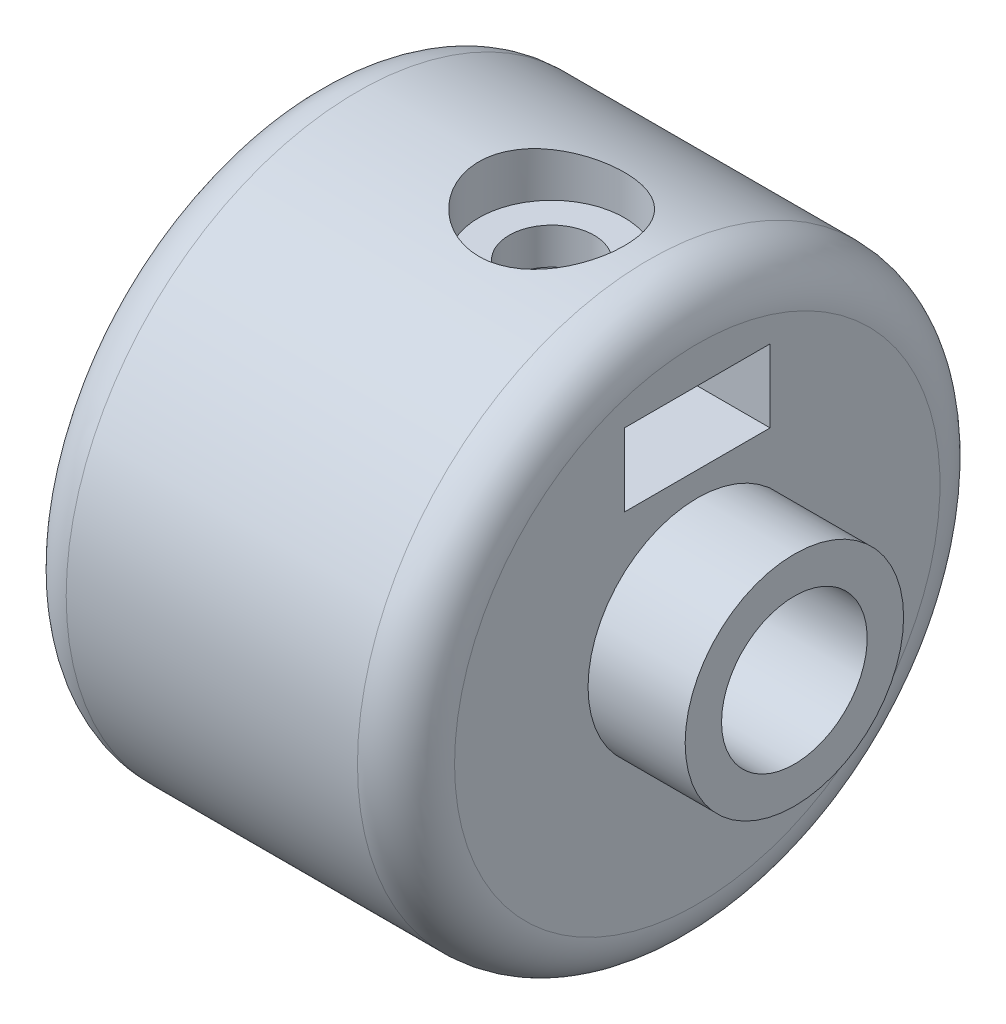
ISO-10303-21;
HEADER;
FILE_DESCRIPTION(('STEP AP214'),'2;1');
FILE_NAME('part.step','',(''),(''),'','','');
FILE_SCHEMA(('AUTOMOTIVE_DESIGN { 1 0 10303 214 1 1 1 1 }'));
ENDSEC;
DATA;
#1=APPLICATION_CONTEXT('core data for automotive mechanical design processes');
#2=APPLICATION_PROTOCOL_DEFINITION('international standard','automotive_design',2000,#1);
#3=PRODUCT_CONTEXT('',#1,'mechanical');
#4=PRODUCT('Part','Part','',(#3));
#5=PRODUCT_RELATED_PRODUCT_CATEGORY('part','',(#4));
#6=PRODUCT_DEFINITION_FORMATION('','',#4);
#7=PRODUCT_DEFINITION_CONTEXT('part definition',#1,'design');
#8=PRODUCT_DEFINITION('design','',#6,#7);
#9=PRODUCT_DEFINITION_SHAPE('','',#8);
#10=(LENGTH_UNIT() NAMED_UNIT(*) SI_UNIT(.MILLI.,.METRE.));
#11=(NAMED_UNIT(*) PLANE_ANGLE_UNIT() SI_UNIT($,.RADIAN.));
#12=(NAMED_UNIT(*) SI_UNIT($,.STERADIAN.) SOLID_ANGLE_UNIT());
#13=UNCERTAINTY_MEASURE_WITH_UNIT(LENGTH_MEASURE(1.E-05),#10,'distance_accuracy_value','');
#14=(GEOMETRIC_REPRESENTATION_CONTEXT(3) GLOBAL_UNCERTAINTY_ASSIGNED_CONTEXT((#13)) GLOBAL_UNIT_ASSIGNED_CONTEXT((#10,
#11,#12)) REPRESENTATION_CONTEXT('',''));
#15=CARTESIAN_POINT('',(0.,0.,0.));
#16=DIRECTION('',(0.,0.,1.));
#17=DIRECTION('',(1.,0.,0.));
#18=AXIS2_PLACEMENT_3D('',#15,#16,#17);
#19=CARTESIAN_POINT('',(-10.,12.,0.));
#20=DIRECTION('',(0.,-1.,0.));
#21=DIRECTION('',(0.,0.,-1.));
#22=AXIS2_PLACEMENT_3D('',#19,#20,#21);
#23=CYLINDRICAL_SURFACE('',#22,1.75);
#24=CARTESIAN_POINT('',(-10.,5.5,0.));
#25=DIRECTION('',(0.,-1.,0.));
#26=DIRECTION('',(0.,0.,-1.));
#27=AXIS2_PLACEMENT_3D('',#24,#25,#26);
#28=CIRCLE('',#27,1.75);
#29=CARTESIAN_POINT('',(-10.,5.5,-1.75));
#30=VERTEX_POINT('',#29);
#31=EDGE_CURVE('E109',#30,#30,#28,.T.);
#32=ORIENTED_EDGE('',*,*,#31,.F.);
#33=EDGE_LOOP('',(#32));
#34=FACE_BOUND('',#33,.T.);
#35=CARTESIAN_POINT('',(-10.,2.43669858620224,-1.75));
#36=CARTESIAN_POINT('',(-9.91136110471854,2.43669821091811,-1.75000045184634));
#37=CARTESIAN_POINT('',(-9.82272389433345,2.44160788460743,-1.74322391194512));
#38=CARTESIAN_POINT('',(-9.64839080882064,2.46040390641731,-1.71658538535329));
#39=CARTESIAN_POINT('',(-9.56269806151959,2.47429950740484,-1.69670991020087));
#40=CARTESIAN_POINT('',(-9.39712873716944,2.50886819103837,-1.64515183199159));
#41=CARTESIAN_POINT('',(-9.31721704167873,2.52949524548538,-1.61354922075016));
#42=CARTESIAN_POINT('',(-9.16386994618549,2.57511999485222,-1.53968773008132));
#43=CARTESIAN_POINT('',(-9.09043662980441,2.60011908828344,-1.49742543895691));
#44=CARTESIAN_POINT('',(-8.94287085459414,2.65514711985922,-1.39777992638195));
#45=CARTESIAN_POINT('',(-8.86962694952593,2.68542397458178,-1.33921745197901));
#46=CARTESIAN_POINT('',(-8.73327083403489,2.74560714742445,-1.21105723337492));
#47=CARTESIAN_POINT('',(-8.67016563364018,2.77551319609256,-1.14145191954028));
#48=CARTESIAN_POINT('',(-8.54963476014383,2.83514492694846,-0.984713035802142));
#49=CARTESIAN_POINT('',(-8.49341124751077,2.86455244924705,-0.896522073845244));
#50=CARTESIAN_POINT('',(-8.39701724909628,2.91640205141093,-0.709891668525833));
#51=CARTESIAN_POINT('',(-8.35683290001997,2.93885014282859,-0.611461168794439));
#52=CARTESIAN_POINT('',(-8.29756042594117,2.97241689810006,-0.416649273147367));
#53=CARTESIAN_POINT('',(-8.27688067828079,2.98438308199892,-0.32090186102432));
#54=CARTESIAN_POINT('',(-8.25184829751699,2.99890385217236,-0.126621897572965));
#55=CARTESIAN_POINT('',(-8.24748139929854,3.00146666139126,-0.0280918555915901));
#56=CARTESIAN_POINT('',(-8.25485637835022,2.99716974401528,0.156495068538422));
#57=CARTESIAN_POINT('',(-8.2647672886593,2.99138089155147,0.242658294595013));
#58=CARTESIAN_POINT('',(-8.29697354985515,2.97281444912442,0.411844523266138));
#59=CARTESIAN_POINT('',(-8.31926981466797,2.9600363434192,0.494867293660782));
#60=CARTESIAN_POINT('',(-8.37548208779237,2.92848341823654,0.656364893028942));
#61=CARTESIAN_POINT('',(-8.4094859948441,2.90966331095226,0.73479991025317));
#62=CARTESIAN_POINT('',(-8.48787760982114,2.86756375772182,0.884967789919835));
#63=CARTESIAN_POINT('',(-8.53226823101793,2.84428306099947,0.956698764094662));
#64=CARTESIAN_POINT('',(-8.63598875036744,2.79209374170037,1.10031993041439));
#65=CARTESIAN_POINT('',(-8.6964533298607,2.76284559232328,1.17126676062861));
#66=CARTESIAN_POINT('',(-8.82766555056707,2.70341339686186,1.30259918374289));
#67=CARTESIAN_POINT('',(-8.89842628536471,2.67322819817167,1.3629711098475));
#68=CARTESIAN_POINT('',(-9.05717674636124,2.6116088402491,1.47789838153368));
#69=CARTESIAN_POINT('',(-9.14619837102356,2.58038307336381,1.5311529754472));
#70=CARTESIAN_POINT('',(-9.33390848288251,2.52452387398174,1.62161168095689));
#71=CARTESIAN_POINT('',(-9.43257908246313,2.49987854748401,1.65884482652417));
#72=CARTESIAN_POINT('',(-9.61276599091687,2.46608582417186,1.70853720110661));
#73=CARTESIAN_POINT('',(-9.6928115753789,2.45465048794558,1.72477506877111));
#74=CARTESIAN_POINT('',(-9.85508247481538,2.43967272746156,1.74590213357921));
#75=CARTESIAN_POINT('',(-9.9373054326581,2.43612209475392,1.75080313330495));
#76=CARTESIAN_POINT('',(-10.1016212032816,2.43743053869137,1.74898039241039));
#77=CARTESIAN_POINT('',(-10.1837138340859,2.44229713376167,1.74224625907734));
#78=CARTESIAN_POINT('',(-10.3453621404305,2.45973523645836,1.71753388251395));
#79=CARTESIAN_POINT('',(-10.4249158508094,2.47231256709751,1.69954714130061));
#80=CARTESIAN_POINT('',(-10.5801869976751,2.50365278676384,1.65302928692431));
#81=CARTESIAN_POINT('',(-10.6558724924044,2.52245979649394,1.62442278126808));
#82=CARTESIAN_POINT('',(-10.801648943733,2.56422564054308,1.55765692699783));
#83=CARTESIAN_POINT('',(-10.8717376750208,2.58718611457636,1.5194938033052));
#84=CARTESIAN_POINT('',(-11.0171188563031,2.63944389498437,1.42709875316828));
#85=CARTESIAN_POINT('',(-11.0912263899248,2.66915133905921,1.37123101284258));
#86=CARTESIAN_POINT('',(-11.2297415156961,2.7287086097612,1.24852240970034));
#87=CARTESIAN_POINT('',(-11.2941404266979,2.75855853948194,1.18167183667127));
#88=CARTESIAN_POINT('',(-11.4186237055379,2.81899071549212,1.02989256043404));
#89=CARTESIAN_POINT('',(-11.4774196858398,2.84928138906159,0.943778122538593));
#90=CARTESIAN_POINT('',(-11.5793818001881,2.9034601596626,0.760910913608861));
#91=CARTESIAN_POINT('',(-11.6225596345963,2.92735304610788,0.664166177419412));
#92=CARTESIAN_POINT('',(-11.6883628925836,2.96435322087929,0.470674024896591));
#93=CARTESIAN_POINT('',(-11.7123354536865,2.97815986600771,0.374522814239406));
#94=CARTESIAN_POINT('',(-11.7436647397335,2.9962804721505,0.178706533702763));
#95=CARTESIAN_POINT('',(-11.7510377761703,3.00060375186924,0.0790450111451305));
#96=CARTESIAN_POINT('',(-11.7488661823514,2.99934002716751,-0.107655929988302));
#97=CARTESIAN_POINT('',(-11.7412978970827,2.99491069180818,-0.194734538061881));
#98=CARTESIAN_POINT('',(-11.7134701466853,2.97881697494109,-0.366137785941604));
#99=CARTESIAN_POINT('',(-11.6932102055189,2.96715232205177,-0.450462322323411));
#100=CARTESIAN_POINT('',(-11.641070466725,2.93771241495245,-0.613761582363571));
#101=CARTESIAN_POINT('',(-11.6092520942239,2.91996949045703,-0.69276201643977));
#102=CARTESIAN_POINT('',(-11.5351444018639,2.87979165338307,-0.844368647802307));
#103=CARTESIAN_POINT('',(-11.4928524566044,2.85735556459279,-0.916973235651942));
#104=CARTESIAN_POINT('',(-11.3937651338791,2.80678961708284,-1.06230015031832));
#105=CARTESIAN_POINT('',(-11.3358870507758,2.77830505779609,-1.13415977100245));
#106=CARTESIAN_POINT('',(-11.2098860102852,2.71996380471868,-1.26772272997665));
#107=CARTESIAN_POINT('',(-11.1417509945418,2.69010552501786,-1.32941393272294));
#108=CARTESIAN_POINT('',(-10.9879891095944,2.62832782018948,-1.44805208639207));
#109=CARTESIAN_POINT('',(-10.9012533588189,2.59656217758451,-1.50365362198231));
#110=CARTESIAN_POINT('',(-10.7178650254964,2.53876100901199,-1.59932168084082));
#111=CARTESIAN_POINT('',(-10.6212248150765,2.51271845895715,-1.63940729371889));
#112=CARTESIAN_POINT('',(-10.4376203962233,2.4743509586737,-1.69663483894556));
#113=CARTESIAN_POINT('',(-10.3518579447994,2.46043560953243,-1.71653991344377));
#114=CARTESIAN_POINT('',(-10.1773936680201,2.44161571370903,-1.74321337060432));
#115=CARTESIAN_POINT('',(-10.0886959904762,2.4366989617281,-1.74999954786261));
#116=CARTESIAN_POINT('',(-10.,2.43669858620224,-1.75));
#117=B_SPLINE_CURVE_WITH_KNOTS('',3,(#35,#36,#37,#38,#39,#40,#41,#42,#43,#44,#45,#46,#47,#48,
#49,#50,#51,#52,#53,#54,#55,#56,#57,#58,#59,#60,#61,#62,#63,#64,#65,#66,#67,#68,#69,#70,#71,#72,
#73,#74,#75,#76,#77,#78,#79,#80,#81,#82,#83,#84,#85,#86,#87,#88,#89,#90,#91,#92,#93,#94,#95,#96,
#97,#98,#99,#100,#101,#102,#103,#104,#105,#106,#107,#108,#109,#110,#111,#112,#113,#114,#115,
#116),.UNSPECIFIED.,.T.,.F.,(4,2,2,2,2,2,2,2,2,2,2,2,2,2,2,2,2,2,2,2,2,2,2,2,2,2,2,2,2,2,2,2,2,
2,2,2,2,2,2,2,4),(0.,0.265545218763682,0.531364307474163,0.795402587763074,1.0595254826214,
1.35398659107803,1.64865042554404,1.97283142487701,2.29673161156482,2.5910478996181,
2.88510675625999,3.14464340280145,3.40419920332162,3.66574779852172,3.9273698411442,
4.21928633023893,4.51157734664539,4.83494305243834,5.15772026336277,5.40406403188873,
5.65015122128839,5.89645833389886,6.14295168285401,6.39122950133275,6.63960555026167,
6.93078691809871,7.22222712635785,7.54626723053991,7.87006407425508,8.16844648867915,
8.46653556995421,8.72782114336879,8.98911651764958,9.2490431284122,9.50903496080326,
9.79757898950315,10.0864649272872,10.4083273312523,10.7297924718895,10.9958699008298,
11.2615861659037),.UNSPECIFIED.);
#118=CARTESIAN_POINT('',(-10.,2.43669858620224,-1.75));
#119=VERTEX_POINT('',#118);
#120=EDGE_CURVE('E120',#119,#119,#117,.T.);
#121=ORIENTED_EDGE('',*,*,#120,.T.);
#122=EDGE_LOOP('',(#121));
#123=FACE_BOUND('',#122,.T.);
#124=ADVANCED_FACE('F35',(#34,#123),#23,.F.);
#125=CARTESIAN_POINT('',(-10.,8.5,0.));
#126=DIRECTION('',(0.,1.,0.));
#127=DIRECTION('',(0.,0.,1.));
#128=AXIS2_PLACEMENT_3D('',#125,#126,#127);
#129=CIRCLE('',#128,1.75);
#130=CARTESIAN_POINT('',(-10.,8.5,1.75));
#131=VERTEX_POINT('',#130);
#132=EDGE_CURVE('E103',#131,#131,#129,.T.);
#133=ORIENTED_EDGE('',*,*,#132,.F.);
#134=EDGE_LOOP('',(#133));
#135=FACE_BOUND('',#134,.T.);
#136=CARTESIAN_POINT('',(-10.,10.,0.));
#137=DIRECTION('',(0.,1.,0.));
#138=DIRECTION('',(0.,0.,1.));
#139=AXIS2_PLACEMENT_3D('',#136,#137,#138);
#140=CIRCLE('',#139,1.75);
#141=CARTESIAN_POINT('',(-10.,10.,1.75));
#142=VERTEX_POINT('',#141);
#143=EDGE_CURVE('E115',#142,#142,#140,.T.);
#144=ORIENTED_EDGE('',*,*,#143,.T.);
#145=EDGE_LOOP('',(#144));
#146=FACE_BOUND('',#145,.T.);
#147=ADVANCED_FACE('F140',(#135,#146),#23,.F.);
#148=CARTESIAN_POINT('',(-12.0159026854066,0.,0.));
#149=DIRECTION('',(-1.,0.,0.));
#150=DIRECTION('',(0.,0.,1.));
#151=AXIS2_PLACEMENT_3D('',#148,#149,#150);
#152=CYLINDRICAL_SURFACE('',#151,12.);
#153=CARTESIAN_POINT('',(-6.,0.,0.));
#154=DIRECTION('',(-1.,0.,0.));
#155=DIRECTION('',(0.,0.,1.));
#156=AXIS2_PLACEMENT_3D('',#153,#154,#155);
#157=CIRCLE('',#156,12.);
#158=CARTESIAN_POINT('',(-6.,0.,12.));
#159=VERTEX_POINT('',#158);
#160=EDGE_CURVE('E341',#159,#159,#157,.T.);
#161=ORIENTED_EDGE('',*,*,#160,.T.);
#162=EDGE_LOOP('',(#161));
#163=FACE_BOUND('',#162,.T.);
#164=CARTESIAN_POINT('',(-18.,0.,0.));
#165=DIRECTION('',(1.,0.,0.));
#166=DIRECTION('',(0.,0.,-1.));
#167=AXIS2_PLACEMENT_3D('',#164,#165,#166);
#168=CIRCLE('',#167,12.);
#169=CARTESIAN_POINT('',(-18.,0.,-12.));
#170=VERTEX_POINT('',#169);
#171=EDGE_CURVE('E338',#170,#170,#168,.T.);
#172=ORIENTED_EDGE('',*,*,#171,.T.);
#173=EDGE_LOOP('',(#172));
#174=FACE_BOUND('',#173,.T.);
#175=CARTESIAN_POINT('',(-10.,11.6189500386223,3.));
#176=CARTESIAN_POINT('',(-10.1656609011119,11.6189532010543,2.99999529431169));
#177=CARTESIAN_POINT('',(-10.3313738784142,11.6225316721752,2.98623149459718));
#178=CARTESIAN_POINT('',(-10.6580410938082,11.6364223439108,2.93162775055655));
#179=CARTESIAN_POINT('',(-10.8189925053618,11.6467384634596,2.89077204809053));
#180=CARTESIAN_POINT('',(-11.1313642458246,11.6728646951538,2.78338943955845));
#181=CARTESIAN_POINT('',(-11.2827965864628,11.6886677122855,2.71689567342539));
#182=CARTESIAN_POINT('',(-11.5723730230479,11.7239783043451,2.56022536951366));
#183=CARTESIAN_POINT('',(-11.7105165544963,11.7434860365419,2.47004782627282));
#184=CARTESIAN_POINT('',(-11.9726339743147,11.7844885962675,2.26645011277426));
#185=CARTESIAN_POINT('',(-12.0962723204201,11.8060151714764,2.15260426524486));
#186=CARTESIAN_POINT('',(-12.3229136732324,11.8483545061835,1.9058184769208));
#187=CARTESIAN_POINT('',(-12.4259147507461,11.8691671987967,1.77287675301637));
#188=CARTESIAN_POINT('',(-12.6097305611575,11.908084986247,1.48937424129475));
#189=CARTESIAN_POINT('',(-12.6902156657938,11.9261482488071,1.33859349143414));
#190=CARTESIAN_POINT('',(-12.8245715729837,11.9571697431118,1.02511582115131));
#191=CARTESIAN_POINT('',(-12.8784463022986,11.9701287280121,0.862420662950328));
#192=CARTESIAN_POINT('',(-12.9569774014943,11.9892571061782,0.533230510504994));
#193=CARTESIAN_POINT('',(-12.9822035731919,11.9955587261318,0.366879263458771));
#194=CARTESIAN_POINT('',(-13.0045100551307,12.0011231292876,0.032194583115323));
#195=CARTESIAN_POINT('',(-13.0015945266515,12.0003869531605,-0.136138553445683));
#196=CARTESIAN_POINT('',(-12.9681101796998,11.9920571394424,-0.466056741517163));
#197=CARTESIAN_POINT('',(-12.9381564099354,11.9846160280904,-0.627708646803202));
#198=CARTESIAN_POINT('',(-12.8524344759418,11.9638900382983,-0.94361474224106));
#199=CARTESIAN_POINT('',(-12.7966649375471,11.9506048487814,-1.09786853811132));
#200=CARTESIAN_POINT('',(-12.6603969151755,11.9194501164106,-1.39622011050542));
#201=CARTESIAN_POINT('',(-12.5796795464059,11.9015402363401,-1.54021352929951));
#202=CARTESIAN_POINT('',(-12.3959731850605,11.8630788457163,-1.81282686702147));
#203=CARTESIAN_POINT('',(-12.2929803177272,11.8425268758318,-1.94144410525652));
#204=CARTESIAN_POINT('',(-12.0643495096212,11.8003645652323,-2.18332210525487));
#205=CARTESIAN_POINT('',(-11.9381741291827,11.7787406343036,-2.29607303722559));
#206=CARTESIAN_POINT('',(-11.6684800317517,11.7373805222079,-2.49892912788907));
#207=CARTESIAN_POINT('',(-11.5249605046107,11.7176444292995,-2.58903322813808));
#208=CARTESIAN_POINT('',(-11.2236519590214,11.6822459619518,-2.74436438706776));
#209=CARTESIAN_POINT('',(-11.0657971236246,11.6666038046041,-2.80946870091135));
#210=CARTESIAN_POINT('',(-10.7408974383078,11.641423681784,-2.91205686190915));
#211=CARTESIAN_POINT('',(-10.5738545632185,11.6318844101128,-2.94954661965919));
#212=CARTESIAN_POINT('',(-10.2400485981641,11.6202642720895,-2.99499556639911));
#213=CARTESIAN_POINT('',(-10.0733946479908,11.6179930677232,-3.00370856870295));
#214=CARTESIAN_POINT('',(-9.7410136760977,11.6206481203763,-2.99342038861819));
#215=CARTESIAN_POINT('',(-9.57528657046067,11.6255737148436,-2.97442175741976));
#216=CARTESIAN_POINT('',(-9.25226288206171,11.6418849838198,-2.9099105567259));
#217=CARTESIAN_POINT('',(-9.09487272811696,11.6531636429104,-2.86483688193829));
#218=CARTESIAN_POINT('',(-8.78988225057601,11.6808086191537,-2.74994169800456));
#219=CARTESIAN_POINT('',(-8.64228308913306,11.6971755389569,-2.680117257255));
#220=CARTESIAN_POINT('',(-8.35787046655973,11.7335536451461,-2.51612480152392));
#221=CARTESIAN_POINT('',(-8.22132539194842,11.7536300232869,-2.42150610460277));
#222=CARTESIAN_POINT('',(-7.96577396463823,11.7950049968534,-2.21118087880336));
#223=CARTESIAN_POINT('',(-7.84677050001987,11.8163037927397,-2.09547088441632));
#224=CARTESIAN_POINT('',(-7.62662674891489,11.8583688363813,-1.84278816295418));
#225=CARTESIAN_POINT('',(-7.52600792494144,11.8791084247426,-1.70535585759478));
#226=CARTESIAN_POINT('',(-7.3492769596585,11.9171665993643,-1.41510804808403));
#227=CARTESIAN_POINT('',(-7.27316354007015,11.9344853640474,-1.26229334687277));
#228=CARTESIAN_POINT('',(-7.14826475856648,11.9636413888599,-0.946674605193272));
#229=CARTESIAN_POINT('',(-7.09928285874512,11.9755179602689,-0.783952143083646));
#230=CARTESIAN_POINT('',(-7.0294475984699,11.9926235207495,-0.452249280956421));
#231=CARTESIAN_POINT('',(-7.00858880951315,11.9978537927211,-0.283270095123722));
#232=CARTESIAN_POINT('',(-6.99589723127338,12.0010250822642,0.051250579329969));
#233=CARTESIAN_POINT('',(-7.00329487271377,11.9991593663997,0.216761480898065));
#234=CARTESIAN_POINT('',(-7.04514348188305,11.9887768937233,0.544102489244252));
#235=CARTESIAN_POINT('',(-7.07959364503951,11.9802603347151,0.705932705342785));
#236=CARTESIAN_POINT('',(-7.17415665931258,11.9575629856167,1.02051310693432));
#237=CARTESIAN_POINT('',(-7.23413035994314,11.9434129350718,1.17330748374259));
#238=CARTESIAN_POINT('',(-7.37791173705872,11.9109386674097,1.46675115912487));
#239=CARTESIAN_POINT('',(-7.46172241801145,11.8926139241627,1.6073989237969));
#240=CARTESIAN_POINT('',(-7.6531457019884,11.8532174904086,1.87620578526991));
#241=CARTESIAN_POINT('',(-7.76128042871149,11.8320905082499,2.00398496489501));
#242=CARTESIAN_POINT('',(-7.99726855593204,11.7897194717157,2.23984506082051));
#243=CARTESIAN_POINT('',(-8.12512694833349,11.7684753890191,2.34792097522977));
#244=CARTESIAN_POINT('',(-8.39980424256838,11.7278242753651,2.5432860794155));
#245=CARTESIAN_POINT('',(-8.54693237009576,11.7084589101987,2.63014985824914));
#246=CARTESIAN_POINT('',(-8.85416646962446,11.6743186648448,2.77778068975641));
#247=CARTESIAN_POINT('',(-9.01426289828154,11.6595404469964,2.83856672925646));
#248=CARTESIAN_POINT('',(-9.31173103550548,11.6385572625221,2.92326758571301));
#249=CARTESIAN_POINT('',(-9.44767949315841,11.631259890105,2.95197951179064));
#250=CARTESIAN_POINT('',(-9.72240660699307,11.6214551574786,2.99034687771531));
#251=CARTESIAN_POINT('',(-9.86118502073321,11.6189473886732,3.00000394311525));
#252=CARTESIAN_POINT('',(-10.,11.6189500386223,3.));
#253=B_SPLINE_CURVE_WITH_KNOTS('',3,(#175,#176,#177,#178,#179,#180,#181,#182,#183,#184,#185,
#186,#187,#188,#189,#190,#191,#192,#193,#194,#195,#196,#197,#198,#199,#200,#201,#202,#203,#204,
#205,#206,#207,#208,#209,#210,#211,#212,#213,#214,#215,#216,#217,#218,#219,#220,#221,#222,#223,
#224,#225,#226,#227,#228,#229,#230,#231,#232,#233,#234,#235,#236,#237,#238,#239,#240,#241,#242,
#243,#244,#245,#246,#247,#248,#249,#250,#251,#252),.UNSPECIFIED.,.T.,.F.,(4,2,2,2,2,2,2,2,2,2,2,
2,2,2,2,2,2,2,2,2,2,2,2,2,2,2,2,2,2,2,2,2,2,2,2,2,2,2,4),(0.,0.496472930083363,0.9932348897144,
1.48935687259922,1.98549992106574,2.49148745031571,2.9975222577584,3.51061795677504,
4.02363791816511,4.52626501194416,5.02881778399225,5.52021915226737,6.01164668069744,
6.50751449105334,7.00346862562696,7.51284559886294,8.02224637439763,8.53411718410083,
9.04587840155457,9.54412289717046,10.042321526265,10.5323688601698,11.0224742571164,
11.5221941503692,12.0219962266799,12.5343039716432,13.046584988694,13.5551048737425,
14.0635265869678,14.5582013535888,15.0528614085831,15.5448585187759,16.0369176689162,
16.5407651590442,17.0447403788455,17.5581177274936,18.0711206565002,18.4871739262287,
18.903191701295),.UNSPECIFIED.);
#254=CARTESIAN_POINT('',(-10.,11.6189500386223,3.));
#255=VERTEX_POINT('',#254);
#256=EDGE_CURVE('E129',#255,#255,#253,.T.);
#257=ORIENTED_EDGE('',*,*,#256,.T.);
#258=EDGE_LOOP('',(#257));
#259=FACE_BOUND('',#258,.T.);
#260=ADVANCED_FACE('F144',(#163,#174,#259),#152,.T.);
#261=CARTESIAN_POINT('',(-12.0159026854066,0.,0.));
#262=DIRECTION('',(-1.,0.,0.));
#263=DIRECTION('',(0.,0.,1.));
#264=AXIS2_PLACEMENT_3D('',#261,#262,#263);
#265=CYLINDRICAL_SURFACE('',#264,3.);
#266=CARTESIAN_POINT('',(-15.,0.,0.));
#267=DIRECTION('',(-1.,0.,0.));
#268=DIRECTION('',(0.,0.,1.));
#269=AXIS2_PLACEMENT_3D('',#266,#267,#268);
#270=CIRCLE('',#269,3.);
#271=CARTESIAN_POINT('',(-15.,0.,3.));
#272=VERTEX_POINT('',#271);
#273=EDGE_CURVE('E119',#272,#272,#270,.T.);
#274=ORIENTED_EDGE('',*,*,#273,.T.);
#275=EDGE_LOOP('',(#274));
#276=FACE_BOUND('',#275,.T.);
#277=CARTESIAN_POINT('',(0.,0.,0.));
#278=DIRECTION('',(-1.,0.,0.));
#279=DIRECTION('',(0.,0.,1.));
#280=AXIS2_PLACEMENT_3D('',#277,#278,#279);
#281=CIRCLE('',#280,3.);
#282=CARTESIAN_POINT('',(0.,0.,3.));
#283=VERTEX_POINT('',#282);
#284=EDGE_CURVE('E116',#283,#283,#281,.T.);
#285=ORIENTED_EDGE('',*,*,#284,.F.);
#286=EDGE_LOOP('',(#285));
#287=FACE_BOUND('',#286,.T.);
#288=ORIENTED_EDGE('',*,*,#120,.F.);
#289=EDGE_LOOP('',(#288));
#290=FACE_BOUND('',#289,.T.);
#291=ADVANCED_FACE('F137',(#276,#287,#290),#265,.F.);
#292=CARTESIAN_POINT('',(0.,4.5,0.));
#293=DIRECTION('',(-1.,0.,0.));
#294=DIRECTION('',(0.,0.,1.));
#295=AXIS2_PLACEMENT_3D('',#292,#293,#294);
#296=PLANE('',#295);
#297=CARTESIAN_POINT('',(0.,0.,0.));
#298=DIRECTION('',(-1.,0.,0.));
#299=DIRECTION('',(0.,0.,1.));
#300=AXIS2_PLACEMENT_3D('',#297,#298,#299);
#301=CIRCLE('',#300,4.5);
#302=CARTESIAN_POINT('',(0.,0.,4.5));
#303=VERTEX_POINT('',#302);
#304=EDGE_CURVE('E126',#303,#303,#301,.T.);
#305=ORIENTED_EDGE('',*,*,#304,.F.);
#306=EDGE_LOOP('',(#305));
#307=FACE_BOUND('',#306,.T.);
#308=ORIENTED_EDGE('',*,*,#284,.T.);
#309=EDGE_LOOP('',(#308));
#310=FACE_BOUND('',#309,.T.);
#311=ADVANCED_FACE('F174',(#307,#310),#296,.F.);
#312=CARTESIAN_POINT('',(-12.0159026854066,0.,0.));
#313=DIRECTION('',(-1.,0.,0.));
#314=DIRECTION('',(0.,0.,1.));
#315=AXIS2_PLACEMENT_3D('',#312,#313,#314);
#316=CYLINDRICAL_SURFACE('',#315,4.5);
#317=CARTESIAN_POINT('',(-4.,0.,0.));
#318=DIRECTION('',(-1.,0.,0.));
#319=DIRECTION('',(0.,0.,1.));
#320=AXIS2_PLACEMENT_3D('',#317,#318,#319);
#321=CIRCLE('',#320,4.5);
#322=CARTESIAN_POINT('',(-4.,0.,4.5));
#323=VERTEX_POINT('',#322);
#324=EDGE_CURVE('E123',#323,#323,#321,.T.);
#325=ORIENTED_EDGE('',*,*,#324,.F.);
#326=EDGE_LOOP('',(#325));
#327=FACE_BOUND('',#326,.T.);
#328=ORIENTED_EDGE('',*,*,#304,.T.);
#329=EDGE_LOOP('',(#328));
#330=FACE_BOUND('',#329,.T.);
#331=ADVANCED_FACE('F170',(#327,#330),#316,.T.);
#332=CARTESIAN_POINT('',(-4.,4.5,0.));
#333=DIRECTION('',(-1.,0.,0.));
#334=DIRECTION('',(0.,0.,1.));
#335=AXIS2_PLACEMENT_3D('',#332,#333,#334);
#336=PLANE('',#335);
#337=CARTESIAN_POINT('',(-4.,0.,0.));
#338=DIRECTION('',(-1.,0.,0.));
#339=DIRECTION('',(0.,0.,1.));
#340=AXIS2_PLACEMENT_3D('',#337,#338,#339);
#341=CIRCLE('',#340,10.);
#342=CARTESIAN_POINT('',(-4.,0.,10.));
#343=VERTEX_POINT('',#342);
#344=EDGE_CURVE('E43',#343,#343,#341,.F.);
#345=ORIENTED_EDGE('',*,*,#344,.T.);
#346=EDGE_LOOP('',(#345));
#347=FACE_BOUND('',#346,.T.);
#348=DIRECTION('',(0.,0.,-1.));
#349=VECTOR('',#348,1.);
#350=CARTESIAN_POINT('',(-4.,8.5,0.));
#351=LINE('',#350,#349);
#352=CARTESIAN_POINT('',(-4.,8.5,3.));
#353=VERTEX_POINT('',#352);
#354=CARTESIAN_POINT('',(-4.,8.5,-3.));
#355=VERTEX_POINT('',#354);
#356=EDGE_CURVE('E159',#353,#355,#351,.T.);
#357=ORIENTED_EDGE('',*,*,#356,.T.);
#358=DIRECTION('',(0.,-1.,0.));
#359=VECTOR('',#358,1.);
#360=CARTESIAN_POINT('',(-4.,4.5,-3.));
#361=LINE('',#360,#359);
#362=CARTESIAN_POINT('',(-4.,5.5,-3.));
#363=VERTEX_POINT('',#362);
#364=EDGE_CURVE('E81',#355,#363,#361,.T.);
#365=ORIENTED_EDGE('',*,*,#364,.T.);
#366=DIRECTION('',(0.,0.,1.));
#367=VECTOR('',#366,1.);
#368=CARTESIAN_POINT('',(-4.,5.5,0.));
#369=LINE('',#368,#367);
#370=CARTESIAN_POINT('',(-4.,5.5,3.));
#371=VERTEX_POINT('',#370);
#372=EDGE_CURVE('E58',#363,#371,#369,.T.);
#373=ORIENTED_EDGE('',*,*,#372,.T.);
#374=DIRECTION('',(0.,1.,0.));
#375=VECTOR('',#374,1.);
#376=CARTESIAN_POINT('',(-4.,4.5,3.));
#377=LINE('',#376,#375);
#378=EDGE_CURVE('E335',#371,#353,#377,.T.);
#379=ORIENTED_EDGE('',*,*,#378,.T.);
#380=EDGE_LOOP('',(#357,#365,#373,#379));
#381=FACE_BOUND('',#380,.T.);
#382=ORIENTED_EDGE('',*,*,#324,.T.);
#383=EDGE_LOOP('',(#382));
#384=FACE_BOUND('',#383,.T.);
#385=ADVANCED_FACE('F167',(#347,#381,#384),#336,.F.);
#386=CARTESIAN_POINT('',(-20.,12.,0.));
#387=DIRECTION('',(1.,0.,0.));
#388=DIRECTION('',(0.,0.,-1.));
#389=AXIS2_PLACEMENT_3D('',#386,#387,#388);
#390=PLANE('',#389);
#391=CARTESIAN_POINT('',(-20.,0.,0.));
#392=DIRECTION('',(1.,0.,0.));
#393=DIRECTION('',(0.,0.,-1.));
#394=AXIS2_PLACEMENT_3D('',#391,#392,#393);
#395=CIRCLE('',#394,10.);
#396=CARTESIAN_POINT('',(-20.,0.,-10.));
#397=VERTEX_POINT('',#396);
#398=EDGE_CURVE('E11',#397,#397,#395,.F.);
#399=ORIENTED_EDGE('',*,*,#398,.T.);
#400=EDGE_LOOP('',(#399));
#401=FACE_BOUND('',#400,.T.);
#402=ADVANCED_FACE('F166',(#401),#390,.F.);
#403=CARTESIAN_POINT('',(-15.,3.,0.));
#404=DIRECTION('',(-1.,0.,0.));
#405=DIRECTION('',(0.,0.,1.));
#406=AXIS2_PLACEMENT_3D('',#403,#404,#405);
#407=PLANE('',#406);
#408=ORIENTED_EDGE('',*,*,#273,.F.);
#409=EDGE_LOOP('',(#408));
#410=FACE_BOUND('',#409,.T.);
#411=ADVANCED_FACE('F151',(#410),#407,.F.);
#412=CARTESIAN_POINT('',(-10.,10.,0.));
#413=DIRECTION('',(0.,1.,0.));
#414=DIRECTION('',(0.,0.,1.));
#415=AXIS2_PLACEMENT_3D('',#412,#413,#414);
#416=CYLINDRICAL_SURFACE('',#415,3.);
#417=CARTESIAN_POINT('',(-10.,10.,0.));
#418=DIRECTION('',(0.,1.,0.));
#419=DIRECTION('',(0.,0.,1.));
#420=AXIS2_PLACEMENT_3D('',#417,#418,#419);
#421=CIRCLE('',#420,3.);
#422=CARTESIAN_POINT('',(-10.,10.,3.));
#423=VERTEX_POINT('',#422);
#424=EDGE_CURVE('E112',#423,#423,#421,.T.);
#425=ORIENTED_EDGE('',*,*,#424,.F.);
#426=EDGE_LOOP('',(#425));
#427=FACE_BOUND('',#426,.T.);
#428=ORIENTED_EDGE('',*,*,#256,.F.);
#429=EDGE_LOOP('',(#428));
#430=FACE_BOUND('',#429,.T.);
#431=ADVANCED_FACE('F146',(#427,#430),#416,.F.);
#432=CARTESIAN_POINT('',(-10.,10.,0.));
#433=DIRECTION('',(0.,1.,0.));
#434=DIRECTION('',(0.,0.,1.));
#435=AXIS2_PLACEMENT_3D('',#432,#433,#434);
#436=PLANE('',#435);
#437=ORIENTED_EDGE('',*,*,#143,.F.);
#438=EDGE_LOOP('',(#437));
#439=FACE_BOUND('',#438,.T.);
#440=ORIENTED_EDGE('',*,*,#424,.T.);
#441=EDGE_LOOP('',(#440));
#442=FACE_BOUND('',#441,.T.);
#443=ADVANCED_FACE('F150',(#439,#442),#436,.T.);
#444=CARTESIAN_POINT('',(-15.,8.5,-3.));
#445=DIRECTION('',(0.,0.,-1.));
#446=DIRECTION('',(-1.,0.,0.));
#447=AXIS2_PLACEMENT_3D('',#444,#445,#446);
#448=PLANE('',#447);
#449=DIRECTION('',(1.,0.,0.));
#450=VECTOR('',#449,1.);
#451=CARTESIAN_POINT('',(-15.,8.5,-3.));
#452=LINE('',#451,#450);
#453=CARTESIAN_POINT('',(-15.,8.5,-3.));
#454=VERTEX_POINT('',#453);
#455=EDGE_CURVE('E50',#454,#355,#452,.T.);
#456=ORIENTED_EDGE('',*,*,#455,.F.);
#457=DIRECTION('',(0.,1.,0.));
#458=VECTOR('',#457,1.);
#459=CARTESIAN_POINT('',(-15.,8.5,-3.));
#460=LINE('',#459,#458);
#461=CARTESIAN_POINT('',(-15.,5.5,-3.));
#462=VERTEX_POINT('',#461);
#463=EDGE_CURVE('E78',#462,#454,#460,.T.);
#464=ORIENTED_EDGE('',*,*,#463,.F.);
#465=DIRECTION('',(1.,0.,0.));
#466=VECTOR('',#465,1.);
#467=CARTESIAN_POINT('',(-15.,5.5,-3.));
#468=LINE('',#467,#466);
#469=EDGE_CURVE('E101',#462,#363,#468,.T.);
#470=ORIENTED_EDGE('',*,*,#469,.T.);
#471=ORIENTED_EDGE('',*,*,#364,.F.);
#472=EDGE_LOOP('',(#456,#464,#470,#471));
#473=FACE_BOUND('',#472,.T.);
#474=ADVANCED_FACE('F76',(#473),#448,.F.);
#475=CARTESIAN_POINT('',(-15.,5.5,3.));
#476=DIRECTION('',(0.,-1.,0.));
#477=DIRECTION('',(0.,0.,-1.));
#478=AXIS2_PLACEMENT_3D('',#475,#476,#477);
#479=PLANE('',#478);
#480=ORIENTED_EDGE('',*,*,#31,.T.);
#481=EDGE_LOOP('',(#480));
#482=FACE_BOUND('',#481,.T.);
#483=ORIENTED_EDGE('',*,*,#469,.F.);
#484=DIRECTION('',(0.,0.,-1.));
#485=VECTOR('',#484,1.);
#486=CARTESIAN_POINT('',(-15.,5.5,3.));
#487=LINE('',#486,#485);
#488=CARTESIAN_POINT('',(-15.,5.5,3.));
#489=VERTEX_POINT('',#488);
#490=EDGE_CURVE('E84',#489,#462,#487,.T.);
#491=ORIENTED_EDGE('',*,*,#490,.F.);
#492=DIRECTION('',(1.,0.,0.));
#493=VECTOR('',#492,1.);
#494=CARTESIAN_POINT('',(-15.,5.5,3.));
#495=LINE('',#494,#493);
#496=EDGE_CURVE('E104',#489,#371,#495,.T.);
#497=ORIENTED_EDGE('',*,*,#496,.T.);
#498=ORIENTED_EDGE('',*,*,#372,.F.);
#499=EDGE_LOOP('',(#483,#491,#497,#498));
#500=FACE_BOUND('',#499,.T.);
#501=ADVANCED_FACE('F278',(#482,#500),#479,.F.);
#502=CARTESIAN_POINT('',(-15.,8.5,3.));
#503=DIRECTION('',(0.,0.,1.));
#504=DIRECTION('',(0.,-1.,0.));
#505=AXIS2_PLACEMENT_3D('',#502,#503,#504);
#506=PLANE('',#505);
#507=ORIENTED_EDGE('',*,*,#496,.F.);
#508=DIRECTION('',(0.,-1.,0.));
#509=VECTOR('',#508,1.);
#510=CARTESIAN_POINT('',(-15.,8.5,3.));
#511=LINE('',#510,#509);
#512=CARTESIAN_POINT('',(-15.,8.5,3.));
#513=VERTEX_POINT('',#512);
#514=EDGE_CURVE('E93',#513,#489,#511,.T.);
#515=ORIENTED_EDGE('',*,*,#514,.F.);
#516=DIRECTION('',(1.,0.,0.));
#517=VECTOR('',#516,1.);
#518=CARTESIAN_POINT('',(-15.,8.5,3.));
#519=LINE('',#518,#517);
#520=EDGE_CURVE('E83',#513,#353,#519,.T.);
#521=ORIENTED_EDGE('',*,*,#520,.T.);
#522=ORIENTED_EDGE('',*,*,#378,.F.);
#523=EDGE_LOOP('',(#507,#515,#521,#522));
#524=FACE_BOUND('',#523,.T.);
#525=ADVANCED_FACE('F285',(#524),#506,.F.);
#526=CARTESIAN_POINT('',(-15.,8.5,3.));
#527=DIRECTION('',(0.,1.,0.));
#528=DIRECTION('',(0.,0.,1.));
#529=AXIS2_PLACEMENT_3D('',#526,#527,#528);
#530=PLANE('',#529);
#531=ORIENTED_EDGE('',*,*,#132,.T.);
#532=EDGE_LOOP('',(#531));
#533=FACE_BOUND('',#532,.T.);
#534=ORIENTED_EDGE('',*,*,#520,.F.);
#535=DIRECTION('',(0.,0.,1.));
#536=VECTOR('',#535,1.);
#537=CARTESIAN_POINT('',(-15.,8.5,3.));
#538=LINE('',#537,#536);
#539=EDGE_CURVE('E87',#454,#513,#538,.T.);
#540=ORIENTED_EDGE('',*,*,#539,.F.);
#541=ORIENTED_EDGE('',*,*,#455,.T.);
#542=ORIENTED_EDGE('',*,*,#356,.F.);
#543=EDGE_LOOP('',(#534,#540,#541,#542));
#544=FACE_BOUND('',#543,.T.);
#545=ADVANCED_FACE('F88',(#533,#544),#530,.F.);
#546=CARTESIAN_POINT('',(-15.,0.,0.));
#547=DIRECTION('',(1.,0.,0.));
#548=DIRECTION('',(0.,0.,-1.));
#549=AXIS2_PLACEMENT_3D('',#546,#547,#548);
#550=PLANE('',#549);
#551=ORIENTED_EDGE('',*,*,#463,.T.);
#552=ORIENTED_EDGE('',*,*,#539,.T.);
#553=ORIENTED_EDGE('',*,*,#514,.T.);
#554=ORIENTED_EDGE('',*,*,#490,.T.);
#555=EDGE_LOOP('',(#551,#552,#553,#554));
#556=FACE_BOUND('',#555,.T.);
#557=ADVANCED_FACE('F95',(#556),#550,.T.);
#558=CARTESIAN_POINT('',(-6.,0.,0.));
#559=DIRECTION('',(-1.,0.,0.));
#560=DIRECTION('',(0.,0.,1.));
#561=AXIS2_PLACEMENT_3D('',#558,#559,#560);
#562=TOROIDAL_SURFACE('',#561,10.,2.);
#563=ORIENTED_EDGE('',*,*,#344,.F.);
#564=EDGE_LOOP('',(#563));
#565=FACE_BOUND('',#564,.T.);
#566=ORIENTED_EDGE('',*,*,#160,.F.);
#567=EDGE_LOOP('',(#566));
#568=FACE_BOUND('',#567,.T.);
#569=ADVANCED_FACE('F178',(#565,#568),#562,.T.);
#570=CARTESIAN_POINT('',(-18.,0.,0.));
#571=DIRECTION('',(1.,0.,0.));
#572=DIRECTION('',(0.,0.,-1.));
#573=AXIS2_PLACEMENT_3D('',#570,#571,#572);
#574=TOROIDAL_SURFACE('',#573,10.,2.);
#575=ORIENTED_EDGE('',*,*,#171,.F.);
#576=EDGE_LOOP('',(#575));
#577=FACE_BOUND('',#576,.T.);
#578=ORIENTED_EDGE('',*,*,#398,.F.);
#579=EDGE_LOOP('',(#578));
#580=FACE_BOUND('',#579,.T.);
#581=ADVANCED_FACE('F37',(#577,#580),#574,.T.);
#582=CLOSED_SHELL('',(#124,#147,#260,#291,#311,#331,#385,#402,#411,#431,#443,#474,#501,#525,
#545,#557,#569,#581));
#583=MANIFOLD_SOLID_BREP('B2',#582);
#584=ADVANCED_BREP_SHAPE_REPRESENTATION('',(#18,#583),#14);
#585=SHAPE_DEFINITION_REPRESENTATION(#9,#584);
ENDSEC;
END-ISO-10303-21;
